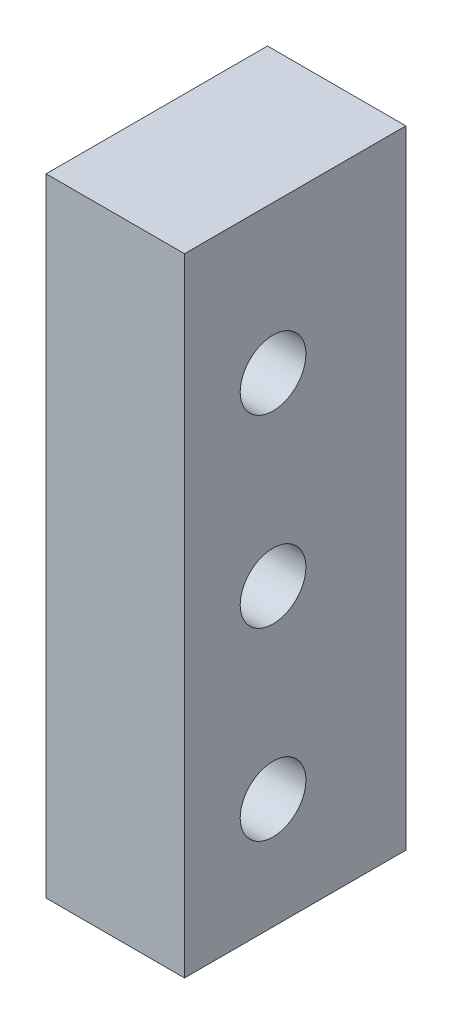
ISO-10303-21;
HEADER;
FILE_DESCRIPTION(('STEP AP214'),'2;1');
FILE_NAME('part.step','',(''),(''),'','','');
FILE_SCHEMA(('AUTOMOTIVE_DESIGN { 1 0 10303 214 1 1 1 1 }'));
ENDSEC;
DATA;
#1=APPLICATION_CONTEXT('core data for automotive mechanical design processes');
#2=APPLICATION_PROTOCOL_DEFINITION('international standard','automotive_design',2000,#1);
#3=PRODUCT_CONTEXT('',#1,'mechanical');
#4=PRODUCT('Part','Part','',(#3));
#5=PRODUCT_RELATED_PRODUCT_CATEGORY('part','',(#4));
#6=PRODUCT_DEFINITION_FORMATION('','',#4);
#7=PRODUCT_DEFINITION_CONTEXT('part definition',#1,'design');
#8=PRODUCT_DEFINITION('design','',#6,#7);
#9=PRODUCT_DEFINITION_SHAPE('','',#8);
#10=(LENGTH_UNIT() NAMED_UNIT(*) SI_UNIT(.MILLI.,.METRE.));
#11=(NAMED_UNIT(*) PLANE_ANGLE_UNIT() SI_UNIT($,.RADIAN.));
#12=(NAMED_UNIT(*) SI_UNIT($,.STERADIAN.) SOLID_ANGLE_UNIT());
#13=UNCERTAINTY_MEASURE_WITH_UNIT(LENGTH_MEASURE(1.E-05),#10,'distance_accuracy_value','');
#14=(GEOMETRIC_REPRESENTATION_CONTEXT(3) GLOBAL_UNCERTAINTY_ASSIGNED_CONTEXT((#13)) GLOBAL_UNIT_ASSIGNED_CONTEXT((#10,
#11,#12)) REPRESENTATION_CONTEXT('',''));
#15=CARTESIAN_POINT('',(0.,0.,0.));
#16=DIRECTION('',(0.,0.,1.));
#17=DIRECTION('',(1.,0.,0.));
#18=AXIS2_PLACEMENT_3D('',#15,#16,#17);
#19=CARTESIAN_POINT('',(4.7625,10.0553965426641,-5.03263025815433));
#20=DIRECTION('',(-1.,0.,0.));
#21=DIRECTION('',(0.,0.,1.));
#22=AXIS2_PLACEMENT_3D('',#19,#20,#21);
#23=PLANE('',#22);
#24=CARTESIAN_POINT('',(4.7625,-1.37460345733587,-0.460630258154334));
#25=DIRECTION('',(1.,0.,0.));
#26=DIRECTION('',(0.,0.,-1.));
#27=AXIS2_PLACEMENT_3D('',#24,#25,#26);
#28=CIRCLE('',#27,1.1303);
#29=CARTESIAN_POINT('',(4.7625,-1.37460345733587,0.669669741845667));
#30=VERTEX_POINT('',#29);
#31=EDGE_CURVE('E115',#30,#30,#28,.T.);
#32=ORIENTED_EDGE('',*,*,#31,.F.);
#33=EDGE_LOOP('',(#32));
#34=FACE_BOUND('',#33,.T.);
#35=DIRECTION('',(0.,1.,0.));
#36=VECTOR('',#35,1.);
#37=CARTESIAN_POINT('',(4.7625,-11.5346034573359,-5.03263025815433));
#38=LINE('',#37,#36);
#39=CARTESIAN_POINT('',(4.7625,-11.5346034573359,-5.03263025815433));
#40=VERTEX_POINT('',#39);
#41=CARTESIAN_POINT('',(4.7625,10.0553965426641,-5.03263025815433));
#42=VERTEX_POINT('',#41);
#43=EDGE_CURVE('E85',#40,#42,#38,.T.);
#44=ORIENTED_EDGE('',*,*,#43,.T.);
#45=DIRECTION('',(0.,0.,1.));
#46=VECTOR('',#45,1.);
#47=CARTESIAN_POINT('',(4.7625,10.0553965426641,2.58736974184567));
#48=LINE('',#47,#46);
#49=CARTESIAN_POINT('',(4.7625,10.0553965426641,2.58736974184567));
#50=VERTEX_POINT('',#49);
#51=EDGE_CURVE('E80',#42,#50,#48,.T.);
#52=ORIENTED_EDGE('',*,*,#51,.T.);
#53=DIRECTION('',(0.,-1.,0.));
#54=VECTOR('',#53,1.);
#55=CARTESIAN_POINT('',(4.7625,-11.5346034573359,2.58736974184567));
#56=LINE('',#55,#54);
#57=CARTESIAN_POINT('',(4.7625,-11.5346034573359,2.58736974184567));
#58=VERTEX_POINT('',#57);
#59=EDGE_CURVE('E83',#50,#58,#56,.T.);
#60=ORIENTED_EDGE('',*,*,#59,.T.);
#61=DIRECTION('',(0.,0.,-1.));
#62=VECTOR('',#61,1.);
#63=CARTESIAN_POINT('',(4.7625,-11.5346034573359,2.58736974184567));
#64=LINE('',#63,#62);
#65=EDGE_CURVE('E50',#58,#40,#64,.T.);
#66=ORIENTED_EDGE('',*,*,#65,.T.);
#67=EDGE_LOOP('',(#44,#52,#60,#66));
#68=FACE_BOUND('',#67,.T.);
#69=CARTESIAN_POINT('',(4.7625,4.97539654266413,-0.460630258154334));
#70=DIRECTION('',(1.,0.,0.));
#71=DIRECTION('',(0.,0.,-1.));
#72=AXIS2_PLACEMENT_3D('',#69,#70,#71);
#73=CIRCLE('',#72,1.1303);
#74=CARTESIAN_POINT('',(4.7625,4.97539654266413,0.669669741845667));
#75=VERTEX_POINT('',#74);
#76=EDGE_CURVE('E100',#75,#75,#73,.T.);
#77=ORIENTED_EDGE('',*,*,#76,.F.);
#78=EDGE_LOOP('',(#77));
#79=FACE_BOUND('',#78,.T.);
#80=CARTESIAN_POINT('',(4.7625,-7.72460345733587,-0.460630258154334));
#81=DIRECTION('',(1.,0.,0.));
#82=DIRECTION('',(0.,0.,-1.));
#83=AXIS2_PLACEMENT_3D('',#80,#81,#82);
#84=CIRCLE('',#83,1.1303);
#85=CARTESIAN_POINT('',(4.7625,-7.72460345733587,0.669669741845667));
#86=VERTEX_POINT('',#85);
#87=EDGE_CURVE('E121',#86,#86,#84,.T.);
#88=ORIENTED_EDGE('',*,*,#87,.F.);
#89=EDGE_LOOP('',(#88));
#90=FACE_BOUND('',#89,.T.);
#91=ADVANCED_FACE('F33',(#34,#68,#79,#90),#23,.F.);
#92=CARTESIAN_POINT('',(0.,10.0553965426641,-5.03263025815433));
#93=DIRECTION('',(-1.,0.,0.));
#94=DIRECTION('',(0.,0.,1.));
#95=AXIS2_PLACEMENT_3D('',#92,#93,#94);
#96=PLANE('',#95);
#97=CARTESIAN_POINT('',(0.,-1.37460345733587,-0.460630258154334));
#98=DIRECTION('',(1.,0.,0.));
#99=DIRECTION('',(0.,0.,-1.));
#100=AXIS2_PLACEMENT_3D('',#97,#98,#99);
#101=CIRCLE('',#100,1.1303);
#102=CARTESIAN_POINT('',(0.,-1.37460345733587,0.669669741845667));
#103=VERTEX_POINT('',#102);
#104=EDGE_CURVE('E118',#103,#103,#101,.T.);
#105=ORIENTED_EDGE('',*,*,#104,.T.);
#106=EDGE_LOOP('',(#105));
#107=FACE_BOUND('',#106,.T.);
#108=DIRECTION('',(0.,1.,0.));
#109=VECTOR('',#108,1.);
#110=CARTESIAN_POINT('',(0.,-11.5346034573359,-5.03263025815433));
#111=LINE('',#110,#109);
#112=CARTESIAN_POINT('',(0.,-11.5346034573359,-5.03263025815433));
#113=VERTEX_POINT('',#112);
#114=CARTESIAN_POINT('',(0.,10.0553965426641,-5.03263025815433));
#115=VERTEX_POINT('',#114);
#116=EDGE_CURVE('E97',#113,#115,#111,.T.);
#117=ORIENTED_EDGE('',*,*,#116,.F.);
#118=DIRECTION('',(0.,0.,-1.));
#119=VECTOR('',#118,1.);
#120=CARTESIAN_POINT('',(0.,-11.5346034573359,2.58736974184567));
#121=LINE('',#120,#119);
#122=CARTESIAN_POINT('',(0.,-11.5346034573359,2.58736974184567));
#123=VERTEX_POINT('',#122);
#124=EDGE_CURVE('E73',#123,#113,#121,.T.);
#125=ORIENTED_EDGE('',*,*,#124,.F.);
#126=DIRECTION('',(0.,-1.,0.));
#127=VECTOR('',#126,1.);
#128=CARTESIAN_POINT('',(0.,-11.5346034573359,2.58736974184567));
#129=LINE('',#128,#127);
#130=CARTESIAN_POINT('',(0.,10.0553965426641,2.58736974184567));
#131=VERTEX_POINT('',#130);
#132=EDGE_CURVE('E67',#131,#123,#129,.T.);
#133=ORIENTED_EDGE('',*,*,#132,.F.);
#134=DIRECTION('',(0.,0.,1.));
#135=VECTOR('',#134,1.);
#136=CARTESIAN_POINT('',(0.,10.0553965426641,2.58736974184567));
#137=LINE('',#136,#135);
#138=EDGE_CURVE('E89',#115,#131,#137,.T.);
#139=ORIENTED_EDGE('',*,*,#138,.F.);
#140=EDGE_LOOP('',(#117,#125,#133,#139));
#141=FACE_BOUND('',#140,.T.);
#142=CARTESIAN_POINT('',(0.,4.97539654266413,-0.460630258154334));
#143=DIRECTION('',(1.,0.,0.));
#144=DIRECTION('',(0.,0.,-1.));
#145=AXIS2_PLACEMENT_3D('',#142,#143,#144);
#146=CIRCLE('',#145,1.1303);
#147=CARTESIAN_POINT('',(0.,4.97539654266413,0.669669741845667));
#148=VERTEX_POINT('',#147);
#149=EDGE_CURVE('E112',#148,#148,#146,.T.);
#150=ORIENTED_EDGE('',*,*,#149,.T.);
#151=EDGE_LOOP('',(#150));
#152=FACE_BOUND('',#151,.T.);
#153=CARTESIAN_POINT('',(0.,-7.72460345733587,-0.460630258154334));
#154=DIRECTION('',(1.,0.,0.));
#155=DIRECTION('',(0.,0.,-1.));
#156=AXIS2_PLACEMENT_3D('',#153,#154,#155);
#157=CIRCLE('',#156,1.1303);
#158=CARTESIAN_POINT('',(0.,-7.72460345733587,0.669669741845667));
#159=VERTEX_POINT('',#158);
#160=EDGE_CURVE('E124',#159,#159,#157,.T.);
#161=ORIENTED_EDGE('',*,*,#160,.T.);
#162=EDGE_LOOP('',(#161));
#163=FACE_BOUND('',#162,.T.);
#164=ADVANCED_FACE('F108',(#107,#141,#152,#163),#96,.T.);
#165=CARTESIAN_POINT('',(4.7625,-11.5346034573359,-5.03263025815433));
#166=DIRECTION('',(0.,0.,1.));
#167=DIRECTION('',(1.,0.,0.));
#168=AXIS2_PLACEMENT_3D('',#165,#166,#167);
#169=PLANE('',#168);
#170=ORIENTED_EDGE('',*,*,#116,.T.);
#171=DIRECTION('',(-1.,0.,0.));
#172=VECTOR('',#171,1.);
#173=CARTESIAN_POINT('',(4.7625,10.0553965426641,-5.03263025815433));
#174=LINE('',#173,#172);
#175=EDGE_CURVE('E11',#42,#115,#174,.T.);
#176=ORIENTED_EDGE('',*,*,#175,.F.);
#177=ORIENTED_EDGE('',*,*,#43,.F.);
#178=DIRECTION('',(-1.,0.,0.));
#179=VECTOR('',#178,1.);
#180=CARTESIAN_POINT('',(4.7625,-11.5346034573359,-5.03263025815433));
#181=LINE('',#180,#179);
#182=EDGE_CURVE('E93',#40,#113,#181,.T.);
#183=ORIENTED_EDGE('',*,*,#182,.T.);
#184=EDGE_LOOP('',(#170,#176,#177,#183));
#185=FACE_BOUND('',#184,.T.);
#186=ADVANCED_FACE('F35',(#185),#169,.F.);
#187=CARTESIAN_POINT('',(4.7625,10.0553965426641,2.58736974184567));
#188=DIRECTION('',(0.,-1.,0.));
#189=DIRECTION('',(0.,0.,-1.));
#190=AXIS2_PLACEMENT_3D('',#187,#188,#189);
#191=PLANE('',#190);
#192=ORIENTED_EDGE('',*,*,#138,.T.);
#193=DIRECTION('',(-1.,0.,0.));
#194=VECTOR('',#193,1.);
#195=CARTESIAN_POINT('',(4.7625,10.0553965426641,2.58736974184567));
#196=LINE('',#195,#194);
#197=EDGE_CURVE('E42',#50,#131,#196,.T.);
#198=ORIENTED_EDGE('',*,*,#197,.F.);
#199=ORIENTED_EDGE('',*,*,#51,.F.);
#200=ORIENTED_EDGE('',*,*,#175,.T.);
#201=EDGE_LOOP('',(#192,#198,#199,#200));
#202=FACE_BOUND('',#201,.T.);
#203=ADVANCED_FACE('F88',(#202),#191,.F.);
#204=CARTESIAN_POINT('',(4.7625,-11.5346034573359,2.58736974184567));
#205=DIRECTION('',(0.,0.,-1.));
#206=DIRECTION('',(-1.,0.,0.));
#207=AXIS2_PLACEMENT_3D('',#204,#205,#206);
#208=PLANE('',#207);
#209=ORIENTED_EDGE('',*,*,#132,.T.);
#210=DIRECTION('',(-1.,0.,0.));
#211=VECTOR('',#210,1.);
#212=CARTESIAN_POINT('',(4.7625,-11.5346034573359,2.58736974184567));
#213=LINE('',#212,#211);
#214=EDGE_CURVE('E90',#58,#123,#213,.T.);
#215=ORIENTED_EDGE('',*,*,#214,.F.);
#216=ORIENTED_EDGE('',*,*,#59,.F.);
#217=ORIENTED_EDGE('',*,*,#197,.T.);
#218=EDGE_LOOP('',(#209,#215,#216,#217));
#219=FACE_BOUND('',#218,.T.);
#220=ADVANCED_FACE('F91',(#219),#208,.F.);
#221=CARTESIAN_POINT('',(4.7625,-11.5346034573359,2.58736974184567));
#222=DIRECTION('',(0.,1.,0.));
#223=DIRECTION('',(0.,0.,1.));
#224=AXIS2_PLACEMENT_3D('',#221,#222,#223);
#225=PLANE('',#224);
#226=ORIENTED_EDGE('',*,*,#124,.T.);
#227=ORIENTED_EDGE('',*,*,#182,.F.);
#228=ORIENTED_EDGE('',*,*,#65,.F.);
#229=ORIENTED_EDGE('',*,*,#214,.T.);
#230=EDGE_LOOP('',(#226,#227,#228,#229));
#231=FACE_BOUND('',#230,.T.);
#232=ADVANCED_FACE('F105',(#231),#225,.F.);
#233=CARTESIAN_POINT('',(4.7625,4.97539654266413,-0.460630258154334));
#234=DIRECTION('',(-1.,0.,0.));
#235=DIRECTION('',(0.,0.,1.));
#236=AXIS2_PLACEMENT_3D('',#233,#234,#235);
#237=CYLINDRICAL_SURFACE('',#236,1.1303);
#238=CARTESIAN_POINT('',(4.7625,4.97539654266413,0.669669741845667));
#239=CARTESIAN_POINT('',(4.712890625,4.97539654266413,0.669669741845667));
#240=CARTESIAN_POINT('',(4.66328125,4.97539654266413,0.669669741845667));
#241=CARTESIAN_POINT('',(4.5640625,4.97539654266413,0.669669741845667));
#242=CARTESIAN_POINT('',(4.514453125,4.97539654266413,0.669669741845667));
#243=CARTESIAN_POINT('',(4.415234375,4.97539654266413,0.669669741845667));
#244=CARTESIAN_POINT('',(4.365625,4.97539654266413,0.669669741845667));
#245=CARTESIAN_POINT('',(4.26640625,4.97539654266413,0.669669741845667));
#246=CARTESIAN_POINT('',(4.216796875,4.97539654266413,0.669669741845667));
#247=CARTESIAN_POINT('',(4.117578125,4.97539654266413,0.669669741845667));
#248=CARTESIAN_POINT('',(4.06796875,4.97539654266413,0.669669741845667));
#249=CARTESIAN_POINT('',(3.96875,4.97539654266413,0.669669741845667));
#250=CARTESIAN_POINT('',(3.919140625,4.97539654266413,0.669669741845667));
#251=CARTESIAN_POINT('',(3.819921875,4.97539654266413,0.669669741845667));
#252=CARTESIAN_POINT('',(3.7703125,4.97539654266413,0.669669741845667));
#253=CARTESIAN_POINT('',(3.67109375,4.97539654266413,0.669669741845667));
#254=CARTESIAN_POINT('',(3.621484375,4.97539654266413,0.669669741845667));
#255=CARTESIAN_POINT('',(3.522265625,4.97539654266413,0.669669741845667));
#256=CARTESIAN_POINT('',(3.47265625,4.97539654266413,0.669669741845667));
#257=CARTESIAN_POINT('',(3.3734375,4.97539654266413,0.669669741845667));
#258=CARTESIAN_POINT('',(3.323828125,4.97539654266413,0.669669741845667));
#259=CARTESIAN_POINT('',(3.224609375,4.97539654266413,0.669669741845667));
#260=CARTESIAN_POINT('',(3.175,4.97539654266413,0.669669741845667));
#261=CARTESIAN_POINT('',(3.07578125,4.97539654266413,0.669669741845667));
#262=CARTESIAN_POINT('',(3.026171875,4.97539654266413,0.669669741845667));
#263=CARTESIAN_POINT('',(2.926953125,4.97539654266413,0.669669741845667));
#264=CARTESIAN_POINT('',(2.87734375,4.97539654266413,0.669669741845667));
#265=CARTESIAN_POINT('',(2.778125,4.97539654266413,0.669669741845667));
#266=CARTESIAN_POINT('',(2.728515625,4.97539654266413,0.669669741845667));
#267=CARTESIAN_POINT('',(2.629296875,4.97539654266413,0.669669741845667));
#268=CARTESIAN_POINT('',(2.5796875,4.97539654266413,0.669669741845667));
#269=CARTESIAN_POINT('',(2.48046875,4.97539654266413,0.669669741845667));
#270=CARTESIAN_POINT('',(2.430859375,4.97539654266413,0.669669741845667));
#271=CARTESIAN_POINT('',(2.331640625,4.97539654266413,0.669669741845667));
#272=CARTESIAN_POINT('',(2.28203125,4.97539654266413,0.669669741845667));
#273=CARTESIAN_POINT('',(2.1828125,4.97539654266413,0.669669741845667));
#274=CARTESIAN_POINT('',(2.133203125,4.97539654266413,0.669669741845667));
#275=CARTESIAN_POINT('',(2.033984375,4.97539654266413,0.669669741845667));
#276=CARTESIAN_POINT('',(1.984375,4.97539654266413,0.669669741845667));
#277=CARTESIAN_POINT('',(1.88515625,4.97539654266413,0.669669741845667));
#278=CARTESIAN_POINT('',(1.835546875,4.97539654266413,0.669669741845667));
#279=CARTESIAN_POINT('',(1.736328125,4.97539654266413,0.669669741845667));
#280=CARTESIAN_POINT('',(1.68671875,4.97539654266413,0.669669741845667));
#281=CARTESIAN_POINT('',(1.5875,4.97539654266413,0.669669741845667));
#282=CARTESIAN_POINT('',(1.537890625,4.97539654266413,0.669669741845667));
#283=CARTESIAN_POINT('',(1.438671875,4.97539654266413,0.669669741845667));
#284=CARTESIAN_POINT('',(1.3890625,4.97539654266413,0.669669741845667));
#285=CARTESIAN_POINT('',(1.28984375,4.97539654266413,0.669669741845667));
#286=CARTESIAN_POINT('',(1.240234375,4.97539654266413,0.669669741845667));
#287=CARTESIAN_POINT('',(1.141015625,4.97539654266413,0.669669741845667));
#288=CARTESIAN_POINT('',(1.09140625,4.97539654266413,0.669669741845667));
#289=CARTESIAN_POINT('',(0.992187499999999,4.97539654266413,0.669669741845667));
#290=CARTESIAN_POINT('',(0.942578124999999,4.97539654266413,0.669669741845667));
#291=CARTESIAN_POINT('',(0.843359375,4.97539654266413,0.669669741845667));
#292=CARTESIAN_POINT('',(0.79375,4.97539654266413,0.669669741845667));
#293=CARTESIAN_POINT('',(0.69453125,4.97539654266413,0.669669741845667));
#294=CARTESIAN_POINT('',(0.644921875,4.97539654266413,0.669669741845667));
#295=CARTESIAN_POINT('',(0.545703125,4.97539654266413,0.669669741845667));
#296=CARTESIAN_POINT('',(0.49609375,4.97539654266413,0.669669741845667));
#297=CARTESIAN_POINT('',(0.396875,4.97539654266413,0.669669741845667));
#298=CARTESIAN_POINT('',(0.347265625,4.97539654266413,0.669669741845667));
#299=CARTESIAN_POINT('',(0.248046875,4.97539654266413,0.669669741845667));
#300=CARTESIAN_POINT('',(0.1984375,4.97539654266413,0.669669741845667));
#301=CARTESIAN_POINT('',(0.09921875,4.97539654266413,0.669669741845667));
#302=CARTESIAN_POINT('',(0.049609375,4.97539654266413,0.669669741845667));
#303=CARTESIAN_POINT('',(0.,4.97539654266413,0.669669741845667));
#304=B_SPLINE_CURVE_WITH_KNOTS('',3,(#238,#239,#240,#241,#242,#243,#244,#245,#246,#247,#248,
#249,#250,#251,#252,#253,#254,#255,#256,#257,#258,#259,#260,#261,#262,#263,#264,#265,#266,#267,
#268,#269,#270,#271,#272,#273,#274,#275,#276,#277,#278,#279,#280,#281,#282,#283,#284,#285,#286,
#287,#288,#289,#290,#291,#292,#293,#294,#295,#296,#297,#298,#299,#300,#301,#302,#303),
.UNSPECIFIED.,.F.,.F.,(4,2,2,2,2,2,2,2,2,2,2,2,2,2,2,2,2,2,2,2,2,2,2,2,2,2,2,2,2,2,2,2,4),(0.,
0.148828125,0.29765625,0.446484375,0.5953125,0.744140625,0.892968750000001,1.041796875,1.190625,
1.339453125,1.48828125,1.637109375,1.7859375,1.934765625,2.08359375,2.232421875,2.38125,
2.530078125,2.67890625,2.827734375,2.9765625,3.125390625,3.27421875,3.423046875,3.571875,
3.720703125,3.86953125,4.018359375,4.1671875,4.316015625,4.46484375,4.613671875,4.7625),.UNSPECIFIED.);
#305=EDGE_CURVE('BSEAM143',#75,#148,#304,.T.);
#306=ORIENTED_EDGE('',*,*,#76,.T.);
#307=ORIENTED_EDGE('',*,*,#149,.F.);
#308=ORIENTED_EDGE('',*,*,#305,.T.);
#309=ORIENTED_EDGE('',*,*,#305,.F.);
#310=EDGE_LOOP('',(#306,#308,#307,#309));
#311=FACE_BOUND('',#310,.T.);
#312=ADVANCED_FACE('F143',(#311),#237,.F.);
#313=CARTESIAN_POINT('',(4.7625,-1.37460345733587,-0.460630258154334));
#314=DIRECTION('',(-1.,0.,0.));
#315=DIRECTION('',(0.,0.,1.));
#316=AXIS2_PLACEMENT_3D('',#313,#314,#315);
#317=CYLINDRICAL_SURFACE('',#316,1.1303);
#318=CARTESIAN_POINT('',(4.7625,-1.37460345733587,0.669669741845667));
#319=CARTESIAN_POINT('',(4.712890625,-1.37460345733587,0.669669741845667));
#320=CARTESIAN_POINT('',(4.66328125,-1.37460345733587,0.669669741845667));
#321=CARTESIAN_POINT('',(4.5640625,-1.37460345733587,0.669669741845667));
#322=CARTESIAN_POINT('',(4.514453125,-1.37460345733587,0.669669741845667));
#323=CARTESIAN_POINT('',(4.415234375,-1.37460345733587,0.669669741845667));
#324=CARTESIAN_POINT('',(4.365625,-1.37460345733587,0.669669741845667));
#325=CARTESIAN_POINT('',(4.26640625,-1.37460345733587,0.669669741845667));
#326=CARTESIAN_POINT('',(4.216796875,-1.37460345733587,0.669669741845667));
#327=CARTESIAN_POINT('',(4.117578125,-1.37460345733587,0.669669741845667));
#328=CARTESIAN_POINT('',(4.06796875,-1.37460345733587,0.669669741845667));
#329=CARTESIAN_POINT('',(3.96875,-1.37460345733587,0.669669741845667));
#330=CARTESIAN_POINT('',(3.919140625,-1.37460345733587,0.669669741845667));
#331=CARTESIAN_POINT('',(3.819921875,-1.37460345733587,0.669669741845667));
#332=CARTESIAN_POINT('',(3.7703125,-1.37460345733587,0.669669741845667));
#333=CARTESIAN_POINT('',(3.67109375,-1.37460345733587,0.669669741845667));
#334=CARTESIAN_POINT('',(3.621484375,-1.37460345733587,0.669669741845667));
#335=CARTESIAN_POINT('',(3.522265625,-1.37460345733587,0.669669741845667));
#336=CARTESIAN_POINT('',(3.47265625,-1.37460345733587,0.669669741845667));
#337=CARTESIAN_POINT('',(3.3734375,-1.37460345733587,0.669669741845667));
#338=CARTESIAN_POINT('',(3.323828125,-1.37460345733587,0.669669741845667));
#339=CARTESIAN_POINT('',(3.224609375,-1.37460345733587,0.669669741845667));
#340=CARTESIAN_POINT('',(3.175,-1.37460345733587,0.669669741845667));
#341=CARTESIAN_POINT('',(3.07578125,-1.37460345733587,0.669669741845667));
#342=CARTESIAN_POINT('',(3.026171875,-1.37460345733587,0.669669741845667));
#343=CARTESIAN_POINT('',(2.926953125,-1.37460345733587,0.669669741845667));
#344=CARTESIAN_POINT('',(2.87734375,-1.37460345733587,0.669669741845667));
#345=CARTESIAN_POINT('',(2.778125,-1.37460345733587,0.669669741845667));
#346=CARTESIAN_POINT('',(2.728515625,-1.37460345733587,0.669669741845667));
#347=CARTESIAN_POINT('',(2.629296875,-1.37460345733587,0.669669741845667));
#348=CARTESIAN_POINT('',(2.5796875,-1.37460345733587,0.669669741845667));
#349=CARTESIAN_POINT('',(2.48046875,-1.37460345733587,0.669669741845667));
#350=CARTESIAN_POINT('',(2.430859375,-1.37460345733587,0.669669741845667));
#351=CARTESIAN_POINT('',(2.331640625,-1.37460345733587,0.669669741845667));
#352=CARTESIAN_POINT('',(2.28203125,-1.37460345733587,0.669669741845667));
#353=CARTESIAN_POINT('',(2.1828125,-1.37460345733587,0.669669741845667));
#354=CARTESIAN_POINT('',(2.133203125,-1.37460345733587,0.669669741845667));
#355=CARTESIAN_POINT('',(2.033984375,-1.37460345733587,0.669669741845667));
#356=CARTESIAN_POINT('',(1.984375,-1.37460345733587,0.669669741845667));
#357=CARTESIAN_POINT('',(1.88515625,-1.37460345733587,0.669669741845667));
#358=CARTESIAN_POINT('',(1.835546875,-1.37460345733587,0.669669741845667));
#359=CARTESIAN_POINT('',(1.736328125,-1.37460345733587,0.669669741845667));
#360=CARTESIAN_POINT('',(1.68671875,-1.37460345733587,0.669669741845667));
#361=CARTESIAN_POINT('',(1.5875,-1.37460345733587,0.669669741845667));
#362=CARTESIAN_POINT('',(1.537890625,-1.37460345733587,0.669669741845667));
#363=CARTESIAN_POINT('',(1.438671875,-1.37460345733587,0.669669741845667));
#364=CARTESIAN_POINT('',(1.3890625,-1.37460345733587,0.669669741845667));
#365=CARTESIAN_POINT('',(1.28984375,-1.37460345733587,0.669669741845667));
#366=CARTESIAN_POINT('',(1.240234375,-1.37460345733587,0.669669741845667));
#367=CARTESIAN_POINT('',(1.141015625,-1.37460345733587,0.669669741845667));
#368=CARTESIAN_POINT('',(1.09140625,-1.37460345733587,0.669669741845667));
#369=CARTESIAN_POINT('',(0.992187499999999,-1.37460345733587,0.669669741845667));
#370=CARTESIAN_POINT('',(0.942578124999999,-1.37460345733587,0.669669741845667));
#371=CARTESIAN_POINT('',(0.843359375,-1.37460345733587,0.669669741845667));
#372=CARTESIAN_POINT('',(0.79375,-1.37460345733587,0.669669741845667));
#373=CARTESIAN_POINT('',(0.69453125,-1.37460345733587,0.669669741845667));
#374=CARTESIAN_POINT('',(0.644921875,-1.37460345733587,0.669669741845667));
#375=CARTESIAN_POINT('',(0.545703125,-1.37460345733587,0.669669741845667));
#376=CARTESIAN_POINT('',(0.49609375,-1.37460345733587,0.669669741845667));
#377=CARTESIAN_POINT('',(0.396875,-1.37460345733587,0.669669741845667));
#378=CARTESIAN_POINT('',(0.347265625,-1.37460345733587,0.669669741845667));
#379=CARTESIAN_POINT('',(0.248046875,-1.37460345733587,0.669669741845667));
#380=CARTESIAN_POINT('',(0.1984375,-1.37460345733587,0.669669741845667));
#381=CARTESIAN_POINT('',(0.09921875,-1.37460345733587,0.669669741845667));
#382=CARTESIAN_POINT('',(0.049609375,-1.37460345733587,0.669669741845667));
#383=CARTESIAN_POINT('',(0.,-1.37460345733587,0.669669741845667));
#384=B_SPLINE_CURVE_WITH_KNOTS('',3,(#318,#319,#320,#321,#322,#323,#324,#325,#326,#327,#328,
#329,#330,#331,#332,#333,#334,#335,#336,#337,#338,#339,#340,#341,#342,#343,#344,#345,#346,#347,
#348,#349,#350,#351,#352,#353,#354,#355,#356,#357,#358,#359,#360,#361,#362,#363,#364,#365,#366,
#367,#368,#369,#370,#371,#372,#373,#374,#375,#376,#377,#378,#379,#380,#381,#382,#383),
.UNSPECIFIED.,.F.,.F.,(4,2,2,2,2,2,2,2,2,2,2,2,2,2,2,2,2,2,2,2,2,2,2,2,2,2,2,2,2,2,2,2,4),(0.,
0.148828125,0.29765625,0.446484375,0.5953125,0.744140625,0.892968750000001,1.041796875,1.190625,
1.339453125,1.48828125,1.637109375,1.7859375,1.934765625,2.08359375,2.232421875,2.38125,
2.530078125,2.67890625,2.827734375,2.9765625,3.125390625,3.27421875,3.423046875,3.571875,
3.720703125,3.86953125,4.018359375,4.1671875,4.316015625,4.46484375,4.613671875,4.7625),.UNSPECIFIED.);
#385=EDGE_CURVE('BSEAM189',#30,#103,#384,.T.);
#386=ORIENTED_EDGE('',*,*,#31,.T.);
#387=ORIENTED_EDGE('',*,*,#104,.F.);
#388=ORIENTED_EDGE('',*,*,#385,.T.);
#389=ORIENTED_EDGE('',*,*,#385,.F.);
#390=EDGE_LOOP('',(#386,#388,#387,#389));
#391=FACE_BOUND('',#390,.T.);
#392=ADVANCED_FACE('F189',(#391),#317,.F.);
#393=CARTESIAN_POINT('',(4.7625,-7.72460345733587,-0.460630258154334));
#394=DIRECTION('',(-1.,0.,0.));
#395=DIRECTION('',(0.,0.,1.));
#396=AXIS2_PLACEMENT_3D('',#393,#394,#395);
#397=CYLINDRICAL_SURFACE('',#396,1.1303);
#398=CARTESIAN_POINT('',(4.7625,-7.72460345733587,0.669669741845667));
#399=CARTESIAN_POINT('',(4.712890625,-7.72460345733587,0.669669741845667));
#400=CARTESIAN_POINT('',(4.66328125,-7.72460345733587,0.669669741845667));
#401=CARTESIAN_POINT('',(4.5640625,-7.72460345733587,0.669669741845667));
#402=CARTESIAN_POINT('',(4.514453125,-7.72460345733587,0.669669741845667));
#403=CARTESIAN_POINT('',(4.415234375,-7.72460345733587,0.669669741845667));
#404=CARTESIAN_POINT('',(4.365625,-7.72460345733587,0.669669741845667));
#405=CARTESIAN_POINT('',(4.26640625,-7.72460345733587,0.669669741845667));
#406=CARTESIAN_POINT('',(4.216796875,-7.72460345733587,0.669669741845667));
#407=CARTESIAN_POINT('',(4.117578125,-7.72460345733587,0.669669741845667));
#408=CARTESIAN_POINT('',(4.06796875,-7.72460345733587,0.669669741845667));
#409=CARTESIAN_POINT('',(3.96875,-7.72460345733587,0.669669741845667));
#410=CARTESIAN_POINT('',(3.919140625,-7.72460345733587,0.669669741845667));
#411=CARTESIAN_POINT('',(3.819921875,-7.72460345733587,0.669669741845667));
#412=CARTESIAN_POINT('',(3.7703125,-7.72460345733587,0.669669741845667));
#413=CARTESIAN_POINT('',(3.67109375,-7.72460345733587,0.669669741845667));
#414=CARTESIAN_POINT('',(3.621484375,-7.72460345733587,0.669669741845667));
#415=CARTESIAN_POINT('',(3.522265625,-7.72460345733587,0.669669741845667));
#416=CARTESIAN_POINT('',(3.47265625,-7.72460345733587,0.669669741845667));
#417=CARTESIAN_POINT('',(3.3734375,-7.72460345733587,0.669669741845667));
#418=CARTESIAN_POINT('',(3.323828125,-7.72460345733587,0.669669741845667));
#419=CARTESIAN_POINT('',(3.224609375,-7.72460345733587,0.669669741845667));
#420=CARTESIAN_POINT('',(3.175,-7.72460345733587,0.669669741845667));
#421=CARTESIAN_POINT('',(3.07578125,-7.72460345733587,0.669669741845667));
#422=CARTESIAN_POINT('',(3.026171875,-7.72460345733587,0.669669741845667));
#423=CARTESIAN_POINT('',(2.926953125,-7.72460345733587,0.669669741845667));
#424=CARTESIAN_POINT('',(2.87734375,-7.72460345733587,0.669669741845667));
#425=CARTESIAN_POINT('',(2.778125,-7.72460345733587,0.669669741845667));
#426=CARTESIAN_POINT('',(2.728515625,-7.72460345733587,0.669669741845667));
#427=CARTESIAN_POINT('',(2.629296875,-7.72460345733587,0.669669741845667));
#428=CARTESIAN_POINT('',(2.5796875,-7.72460345733587,0.669669741845667));
#429=CARTESIAN_POINT('',(2.48046875,-7.72460345733587,0.669669741845667));
#430=CARTESIAN_POINT('',(2.430859375,-7.72460345733587,0.669669741845667));
#431=CARTESIAN_POINT('',(2.331640625,-7.72460345733587,0.669669741845667));
#432=CARTESIAN_POINT('',(2.28203125,-7.72460345733587,0.669669741845667));
#433=CARTESIAN_POINT('',(2.1828125,-7.72460345733587,0.669669741845667));
#434=CARTESIAN_POINT('',(2.133203125,-7.72460345733587,0.669669741845667));
#435=CARTESIAN_POINT('',(2.033984375,-7.72460345733587,0.669669741845667));
#436=CARTESIAN_POINT('',(1.984375,-7.72460345733587,0.669669741845667));
#437=CARTESIAN_POINT('',(1.88515625,-7.72460345733587,0.669669741845667));
#438=CARTESIAN_POINT('',(1.835546875,-7.72460345733587,0.669669741845667));
#439=CARTESIAN_POINT('',(1.736328125,-7.72460345733587,0.669669741845667));
#440=CARTESIAN_POINT('',(1.68671875,-7.72460345733587,0.669669741845667));
#441=CARTESIAN_POINT('',(1.5875,-7.72460345733587,0.669669741845667));
#442=CARTESIAN_POINT('',(1.537890625,-7.72460345733587,0.669669741845667));
#443=CARTESIAN_POINT('',(1.438671875,-7.72460345733587,0.669669741845667));
#444=CARTESIAN_POINT('',(1.3890625,-7.72460345733587,0.669669741845667));
#445=CARTESIAN_POINT('',(1.28984375,-7.72460345733587,0.669669741845667));
#446=CARTESIAN_POINT('',(1.240234375,-7.72460345733587,0.669669741845667));
#447=CARTESIAN_POINT('',(1.141015625,-7.72460345733587,0.669669741845667));
#448=CARTESIAN_POINT('',(1.09140625,-7.72460345733587,0.669669741845667));
#449=CARTESIAN_POINT('',(0.992187499999999,-7.72460345733587,0.669669741845667));
#450=CARTESIAN_POINT('',(0.942578124999999,-7.72460345733587,0.669669741845667));
#451=CARTESIAN_POINT('',(0.843359375,-7.72460345733587,0.669669741845667));
#452=CARTESIAN_POINT('',(0.79375,-7.72460345733587,0.669669741845667));
#453=CARTESIAN_POINT('',(0.69453125,-7.72460345733587,0.669669741845667));
#454=CARTESIAN_POINT('',(0.644921875,-7.72460345733587,0.669669741845667));
#455=CARTESIAN_POINT('',(0.545703125,-7.72460345733587,0.669669741845667));
#456=CARTESIAN_POINT('',(0.49609375,-7.72460345733587,0.669669741845667));
#457=CARTESIAN_POINT('',(0.396875,-7.72460345733587,0.669669741845667));
#458=CARTESIAN_POINT('',(0.347265625,-7.72460345733587,0.669669741845667));
#459=CARTESIAN_POINT('',(0.248046875,-7.72460345733587,0.669669741845667));
#460=CARTESIAN_POINT('',(0.1984375,-7.72460345733587,0.669669741845667));
#461=CARTESIAN_POINT('',(0.09921875,-7.72460345733587,0.669669741845667));
#462=CARTESIAN_POINT('',(0.049609375,-7.72460345733587,0.669669741845667));
#463=CARTESIAN_POINT('',(0.,-7.72460345733587,0.669669741845667));
#464=B_SPLINE_CURVE_WITH_KNOTS('',3,(#398,#399,#400,#401,#402,#403,#404,#405,#406,#407,#408,
#409,#410,#411,#412,#413,#414,#415,#416,#417,#418,#419,#420,#421,#422,#423,#424,#425,#426,#427,
#428,#429,#430,#431,#432,#433,#434,#435,#436,#437,#438,#439,#440,#441,#442,#443,#444,#445,#446,
#447,#448,#449,#450,#451,#452,#453,#454,#455,#456,#457,#458,#459,#460,#461,#462,#463),
.UNSPECIFIED.,.F.,.F.,(4,2,2,2,2,2,2,2,2,2,2,2,2,2,2,2,2,2,2,2,2,2,2,2,2,2,2,2,2,2,2,2,4),(0.,
0.148828125,0.29765625,0.446484375,0.5953125,0.744140625,0.892968750000001,1.041796875,1.190625,
1.339453125,1.48828125,1.637109375,1.7859375,1.934765625,2.08359375,2.232421875,2.38125,
2.530078125,2.67890625,2.827734375,2.9765625,3.125390625,3.27421875,3.423046875,3.571875,
3.720703125,3.86953125,4.018359375,4.1671875,4.316015625,4.46484375,4.613671875,4.7625),.UNSPECIFIED.);
#465=EDGE_CURVE('BSEAM130',#86,#159,#464,.T.);
#466=ORIENTED_EDGE('',*,*,#87,.T.);
#467=ORIENTED_EDGE('',*,*,#160,.F.);
#468=ORIENTED_EDGE('',*,*,#465,.T.);
#469=ORIENTED_EDGE('',*,*,#465,.F.);
#470=EDGE_LOOP('',(#466,#468,#467,#469));
#471=FACE_BOUND('',#470,.T.);
#472=ADVANCED_FACE('F130',(#471),#397,.F.);
#473=CLOSED_SHELL('',(#91,#164,#186,#203,#220,#232,#312,#392,#472));
#474=MANIFOLD_SOLID_BREP('B2',#473);
#475=ADVANCED_BREP_SHAPE_REPRESENTATION('',(#18,#474),#14);
#476=SHAPE_DEFINITION_REPRESENTATION(#9,#475);
ENDSEC;
END-ISO-10303-21;
